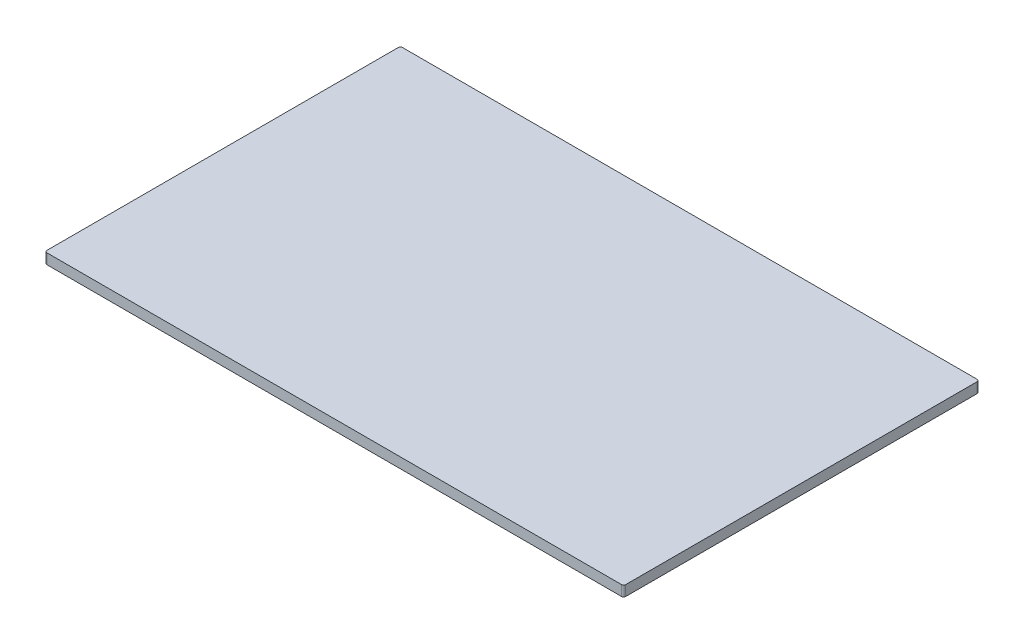
ISO-10303-21;
HEADER;
FILE_DESCRIPTION(('STEP AP214'),'2;1');
FILE_NAME('part.step','',(''),(''),'','','');
FILE_SCHEMA(('AUTOMOTIVE_DESIGN { 1 0 10303 214 1 1 1 1 }'));
ENDSEC;
DATA;
#1=APPLICATION_CONTEXT('core data for automotive mechanical design processes');
#2=APPLICATION_PROTOCOL_DEFINITION('international standard','automotive_design',2000,#1);
#3=PRODUCT_CONTEXT('',#1,'mechanical');
#4=PRODUCT('Part','Part','',(#3));
#5=PRODUCT_RELATED_PRODUCT_CATEGORY('part','',(#4));
#6=PRODUCT_DEFINITION_FORMATION('','',#4);
#7=PRODUCT_DEFINITION_CONTEXT('part definition',#1,'design');
#8=PRODUCT_DEFINITION('design','',#6,#7);
#9=PRODUCT_DEFINITION_SHAPE('','',#8);
#10=(LENGTH_UNIT() NAMED_UNIT(*) SI_UNIT(.MILLI.,.METRE.));
#11=(NAMED_UNIT(*) PLANE_ANGLE_UNIT() SI_UNIT($,.RADIAN.));
#12=(NAMED_UNIT(*) SI_UNIT($,.STERADIAN.) SOLID_ANGLE_UNIT());
#13=UNCERTAINTY_MEASURE_WITH_UNIT(LENGTH_MEASURE(1.E-05),#10,'distance_accuracy_value','');
#14=(GEOMETRIC_REPRESENTATION_CONTEXT(3) GLOBAL_UNCERTAINTY_ASSIGNED_CONTEXT((#13)) GLOBAL_UNIT_ASSIGNED_CONTEXT((#10,
#11,#12)) REPRESENTATION_CONTEXT('',''));
#15=CARTESIAN_POINT('',(0.,0.,0.));
#16=DIRECTION('',(0.,0.,1.));
#17=DIRECTION('',(1.,0.,0.));
#18=AXIS2_PLACEMENT_3D('',#15,#16,#17);
#19=CARTESIAN_POINT('',(-280.,10.,172.));
#20=DIRECTION('',(1.,0.,0.));
#21=DIRECTION('',(0.,0.,-1.));
#22=AXIS2_PLACEMENT_3D('',#19,#20,#21);
#23=PLANE('',#22);
#24=DIRECTION('',(0.,0.,1.));
#25=VECTOR('',#24,1.);
#26=CARTESIAN_POINT('',(-280.,0.,172.));
#27=LINE('',#26,#25);
#28=CARTESIAN_POINT('',(-280.,0.,-170.));
#29=VERTEX_POINT('',#28);
#30=CARTESIAN_POINT('',(-280.,0.,170.));
#31=VERTEX_POINT('',#30);
#32=EDGE_CURVE('E157',#29,#31,#27,.T.);
#33=ORIENTED_EDGE('',*,*,#32,.T.);
#34=DIRECTION('',(0.,-1.,0.));
#35=VECTOR('',#34,1.);
#36=CARTESIAN_POINT('',(-280.,10.,170.));
#37=LINE('',#36,#35);
#38=CARTESIAN_POINT('',(-280.,10.,170.));
#39=VERTEX_POINT('',#38);
#40=EDGE_CURVE('E11',#31,#39,#37,.F.);
#41=ORIENTED_EDGE('',*,*,#40,.T.);
#42=DIRECTION('',(0.,0.,1.));
#43=VECTOR('',#42,1.);
#44=CARTESIAN_POINT('',(-280.,10.,172.));
#45=LINE('',#44,#43);
#46=CARTESIAN_POINT('',(-280.,10.,-170.));
#47=VERTEX_POINT('',#46);
#48=EDGE_CURVE('E125',#47,#39,#45,.T.);
#49=ORIENTED_EDGE('',*,*,#48,.F.);
#50=DIRECTION('',(0.,-1.,0.));
#51=VECTOR('',#50,1.);
#52=CARTESIAN_POINT('',(-280.,10.,-170.));
#53=LINE('',#52,#51);
#54=EDGE_CURVE('E41',#47,#29,#53,.T.);
#55=ORIENTED_EDGE('',*,*,#54,.T.);
#56=EDGE_LOOP('',(#33,#41,#49,#55));
#57=FACE_BOUND('',#56,.T.);
#58=ADVANCED_FACE('F33',(#57),#23,.F.);
#59=CARTESIAN_POINT('',(280.,10.,172.));
#60=DIRECTION('',(0.,0.,-1.));
#61=DIRECTION('',(-1.,0.,0.));
#62=AXIS2_PLACEMENT_3D('',#59,#60,#61);
#63=PLANE('',#62);
#64=DIRECTION('',(1.,0.,0.));
#65=VECTOR('',#64,1.);
#66=CARTESIAN_POINT('',(280.,0.,172.));
#67=LINE('',#66,#65);
#68=CARTESIAN_POINT('',(-278.,0.,172.));
#69=VERTEX_POINT('',#68);
#70=CARTESIAN_POINT('',(278.,0.,172.));
#71=VERTEX_POINT('',#70);
#72=EDGE_CURVE('E130',#69,#71,#67,.T.);
#73=ORIENTED_EDGE('',*,*,#72,.T.);
#74=DIRECTION('',(0.,-1.,0.));
#75=VECTOR('',#74,1.);
#76=CARTESIAN_POINT('',(278.,10.,172.));
#77=LINE('',#76,#75);
#78=CARTESIAN_POINT('',(278.,10.,172.));
#79=VERTEX_POINT('',#78);
#80=EDGE_CURVE('E48',#71,#79,#77,.F.);
#81=ORIENTED_EDGE('',*,*,#80,.T.);
#82=DIRECTION('',(1.,0.,0.));
#83=VECTOR('',#82,1.);
#84=CARTESIAN_POINT('',(280.,10.,172.));
#85=LINE('',#84,#83);
#86=CARTESIAN_POINT('',(-278.,10.,172.));
#87=VERTEX_POINT('',#86);
#88=EDGE_CURVE('E128',#87,#79,#85,.T.);
#89=ORIENTED_EDGE('',*,*,#88,.F.);
#90=DIRECTION('',(0.,-1.,0.));
#91=VECTOR('',#90,1.);
#92=CARTESIAN_POINT('',(-278.,10.,172.));
#93=LINE('',#92,#91);
#94=EDGE_CURVE('E149',#87,#69,#93,.T.);
#95=ORIENTED_EDGE('',*,*,#94,.T.);
#96=EDGE_LOOP('',(#73,#81,#89,#95));
#97=FACE_BOUND('',#96,.T.);
#98=ADVANCED_FACE('F177',(#97),#63,.F.);
#99=CARTESIAN_POINT('',(280.,10.,172.));
#100=DIRECTION('',(-1.,0.,0.));
#101=DIRECTION('',(0.,0.,1.));
#102=AXIS2_PLACEMENT_3D('',#99,#100,#101);
#103=PLANE('',#102);
#104=DIRECTION('',(0.,0.,-1.));
#105=VECTOR('',#104,1.);
#106=CARTESIAN_POINT('',(280.,0.,172.));
#107=LINE('',#106,#105);
#108=CARTESIAN_POINT('',(280.,0.,170.));
#109=VERTEX_POINT('',#108);
#110=CARTESIAN_POINT('',(280.,0.,-170.));
#111=VERTEX_POINT('',#110);
#112=EDGE_CURVE('E126',#109,#111,#107,.T.);
#113=ORIENTED_EDGE('',*,*,#112,.T.);
#114=DIRECTION('',(0.,-1.,0.));
#115=VECTOR('',#114,1.);
#116=CARTESIAN_POINT('',(280.,10.,-170.));
#117=LINE('',#116,#115);
#118=CARTESIAN_POINT('',(280.,10.,-170.));
#119=VERTEX_POINT('',#118);
#120=EDGE_CURVE('E104',#111,#119,#117,.F.);
#121=ORIENTED_EDGE('',*,*,#120,.T.);
#122=DIRECTION('',(0.,0.,-1.));
#123=VECTOR('',#122,1.);
#124=CARTESIAN_POINT('',(280.,10.,172.));
#125=LINE('',#124,#123);
#126=CARTESIAN_POINT('',(280.,10.,170.));
#127=VERTEX_POINT('',#126);
#128=EDGE_CURVE('E165',#127,#119,#125,.T.);
#129=ORIENTED_EDGE('',*,*,#128,.F.);
#130=DIRECTION('',(0.,-1.,0.));
#131=VECTOR('',#130,1.);
#132=CARTESIAN_POINT('',(280.,10.,170.));
#133=LINE('',#132,#131);
#134=EDGE_CURVE('E109',#127,#109,#133,.T.);
#135=ORIENTED_EDGE('',*,*,#134,.T.);
#136=EDGE_LOOP('',(#113,#121,#129,#135));
#137=FACE_BOUND('',#136,.T.);
#138=ADVANCED_FACE('F176',(#137),#103,.F.);
#139=CARTESIAN_POINT('',(280.,10.,-172.));
#140=DIRECTION('',(0.,0.,1.));
#141=DIRECTION('',(1.,0.,0.));
#142=AXIS2_PLACEMENT_3D('',#139,#140,#141);
#143=PLANE('',#142);
#144=DIRECTION('',(-1.,0.,0.));
#145=VECTOR('',#144,1.);
#146=CARTESIAN_POINT('',(280.,10.,-172.));
#147=LINE('',#146,#145);
#148=CARTESIAN_POINT('',(278.,10.,-172.));
#149=VERTEX_POINT('',#148);
#150=CARTESIAN_POINT('',(-278.,10.,-172.));
#151=VERTEX_POINT('',#150);
#152=EDGE_CURVE('E119',#149,#151,#147,.T.);
#153=ORIENTED_EDGE('',*,*,#152,.F.);
#154=DIRECTION('',(0.,-1.,0.));
#155=VECTOR('',#154,1.);
#156=CARTESIAN_POINT('',(278.,10.,-172.));
#157=LINE('',#156,#155);
#158=CARTESIAN_POINT('',(278.,0.,-172.));
#159=VERTEX_POINT('',#158);
#160=EDGE_CURVE('E103',#149,#159,#157,.T.);
#161=ORIENTED_EDGE('',*,*,#160,.T.);
#162=DIRECTION('',(-1.,0.,0.));
#163=VECTOR('',#162,1.);
#164=CARTESIAN_POINT('',(280.,0.,-172.));
#165=LINE('',#164,#163);
#166=CARTESIAN_POINT('',(-278.,0.,-172.));
#167=VERTEX_POINT('',#166);
#168=EDGE_CURVE('E116',#159,#167,#165,.T.);
#169=ORIENTED_EDGE('',*,*,#168,.T.);
#170=DIRECTION('',(0.,-1.,0.));
#171=VECTOR('',#170,1.);
#172=CARTESIAN_POINT('',(-278.,10.,-172.));
#173=LINE('',#172,#171);
#174=EDGE_CURVE('E121',#167,#151,#173,.F.);
#175=ORIENTED_EDGE('',*,*,#174,.T.);
#176=EDGE_LOOP('',(#153,#161,#169,#175));
#177=FACE_BOUND('',#176,.T.);
#178=ADVANCED_FACE('F115',(#177),#143,.F.);
#179=CARTESIAN_POINT('',(0.,10.,0.));
#180=DIRECTION('',(0.,1.,0.));
#181=DIRECTION('',(0.,0.,1.));
#182=AXIS2_PLACEMENT_3D('',#179,#180,#181);
#183=PLANE('',#182);
#184=ORIENTED_EDGE('',*,*,#128,.T.);
#185=CARTESIAN_POINT('',(278.,10.,-170.));
#186=DIRECTION('',(0.,1.,0.));
#187=DIRECTION('',(0.,0.,1.));
#188=AXIS2_PLACEMENT_3D('',#185,#186,#187);
#189=CIRCLE('',#188,2.);
#190=EDGE_CURVE('E147',#119,#149,#189,.T.);
#191=ORIENTED_EDGE('',*,*,#190,.T.);
#192=ORIENTED_EDGE('',*,*,#152,.T.);
#193=CARTESIAN_POINT('',(-278.,10.,-170.));
#194=DIRECTION('',(0.,1.,0.));
#195=DIRECTION('',(0.,0.,1.));
#196=AXIS2_PLACEMENT_3D('',#193,#194,#195);
#197=CIRCLE('',#196,2.);
#198=EDGE_CURVE('E142',#151,#47,#197,.T.);
#199=ORIENTED_EDGE('',*,*,#198,.T.);
#200=ORIENTED_EDGE('',*,*,#48,.T.);
#201=CARTESIAN_POINT('',(-278.,10.,170.));
#202=DIRECTION('',(0.,1.,0.));
#203=DIRECTION('',(0.,0.,1.));
#204=AXIS2_PLACEMENT_3D('',#201,#202,#203);
#205=CIRCLE('',#204,2.);
#206=EDGE_CURVE('E55',#39,#87,#205,.T.);
#207=ORIENTED_EDGE('',*,*,#206,.T.);
#208=ORIENTED_EDGE('',*,*,#88,.T.);
#209=CARTESIAN_POINT('',(278.,10.,170.));
#210=DIRECTION('',(0.,1.,0.));
#211=DIRECTION('',(0.,0.,1.));
#212=AXIS2_PLACEMENT_3D('',#209,#210,#211);
#213=CIRCLE('',#212,2.);
#214=EDGE_CURVE('E145',#79,#127,#213,.T.);
#215=ORIENTED_EDGE('',*,*,#214,.T.);
#216=EDGE_LOOP('',(#184,#191,#192,#199,#200,#207,#208,#215));
#217=FACE_BOUND('',#216,.T.);
#218=ADVANCED_FACE('F169',(#217),#183,.T.);
#219=CARTESIAN_POINT('',(0.,0.,0.));
#220=DIRECTION('',(0.,1.,0.));
#221=DIRECTION('',(0.,0.,1.));
#222=AXIS2_PLACEMENT_3D('',#219,#220,#221);
#223=PLANE('',#222);
#224=ORIENTED_EDGE('',*,*,#168,.F.);
#225=CARTESIAN_POINT('',(278.,0.,-170.));
#226=DIRECTION('',(0.,1.,0.));
#227=DIRECTION('',(0.,0.,1.));
#228=AXIS2_PLACEMENT_3D('',#225,#226,#227);
#229=CIRCLE('',#228,2.);
#230=EDGE_CURVE('E99',#159,#111,#229,.F.);
#231=ORIENTED_EDGE('',*,*,#230,.T.);
#232=ORIENTED_EDGE('',*,*,#112,.F.);
#233=CARTESIAN_POINT('',(278.,0.,170.));
#234=DIRECTION('',(0.,1.,0.));
#235=DIRECTION('',(0.,0.,1.));
#236=AXIS2_PLACEMENT_3D('',#233,#234,#235);
#237=CIRCLE('',#236,2.);
#238=EDGE_CURVE('E110',#109,#71,#237,.F.);
#239=ORIENTED_EDGE('',*,*,#238,.T.);
#240=ORIENTED_EDGE('',*,*,#72,.F.);
#241=CARTESIAN_POINT('',(-278.,0.,170.));
#242=DIRECTION('',(0.,1.,0.));
#243=DIRECTION('',(0.,0.,1.));
#244=AXIS2_PLACEMENT_3D('',#241,#242,#243);
#245=CIRCLE('',#244,2.);
#246=EDGE_CURVE('E136',#69,#31,#245,.F.);
#247=ORIENTED_EDGE('',*,*,#246,.T.);
#248=ORIENTED_EDGE('',*,*,#32,.F.);
#249=CARTESIAN_POINT('',(-278.,0.,-170.));
#250=DIRECTION('',(0.,1.,0.));
#251=DIRECTION('',(0.,0.,1.));
#252=AXIS2_PLACEMENT_3D('',#249,#250,#251);
#253=CIRCLE('',#252,2.);
#254=EDGE_CURVE('E120',#29,#167,#253,.F.);
#255=ORIENTED_EDGE('',*,*,#254,.T.);
#256=EDGE_LOOP('',(#224,#231,#232,#239,#240,#247,#248,#255));
#257=FACE_BOUND('',#256,.T.);
#258=ADVANCED_FACE('F123',(#257),#223,.F.);
#259=CARTESIAN_POINT('',(278.,10.,-170.));
#260=DIRECTION('',(0.,-1.,0.));
#261=DIRECTION('',(0.,0.,-1.));
#262=AXIS2_PLACEMENT_3D('',#259,#260,#261);
#263=CYLINDRICAL_SURFACE('',#262,2.);
#264=ORIENTED_EDGE('',*,*,#190,.F.);
#265=ORIENTED_EDGE('',*,*,#120,.F.);
#266=ORIENTED_EDGE('',*,*,#230,.F.);
#267=ORIENTED_EDGE('',*,*,#160,.F.);
#268=EDGE_LOOP('',(#264,#265,#266,#267));
#269=FACE_BOUND('',#268,.T.);
#270=ADVANCED_FACE('F102',(#269),#263,.T.);
#271=CARTESIAN_POINT('',(278.,10.,170.));
#272=DIRECTION('',(0.,-1.,0.));
#273=DIRECTION('',(0.,0.,-1.));
#274=AXIS2_PLACEMENT_3D('',#271,#272,#273);
#275=CYLINDRICAL_SURFACE('',#274,2.);
#276=ORIENTED_EDGE('',*,*,#214,.F.);
#277=ORIENTED_EDGE('',*,*,#80,.F.);
#278=ORIENTED_EDGE('',*,*,#238,.F.);
#279=ORIENTED_EDGE('',*,*,#134,.F.);
#280=EDGE_LOOP('',(#276,#277,#278,#279));
#281=FACE_BOUND('',#280,.T.);
#282=ADVANCED_FACE('F174',(#281),#275,.T.);
#283=CARTESIAN_POINT('',(-278.,10.,170.));
#284=DIRECTION('',(0.,-1.,0.));
#285=DIRECTION('',(0.,0.,-1.));
#286=AXIS2_PLACEMENT_3D('',#283,#284,#285);
#287=CYLINDRICAL_SURFACE('',#286,2.);
#288=ORIENTED_EDGE('',*,*,#206,.F.);
#289=ORIENTED_EDGE('',*,*,#40,.F.);
#290=ORIENTED_EDGE('',*,*,#246,.F.);
#291=ORIENTED_EDGE('',*,*,#94,.F.);
#292=EDGE_LOOP('',(#288,#289,#290,#291));
#293=FACE_BOUND('',#292,.T.);
#294=ADVANCED_FACE('F179',(#293),#287,.T.);
#295=CARTESIAN_POINT('',(-278.,10.,-170.));
#296=DIRECTION('',(0.,-1.,0.));
#297=DIRECTION('',(0.,0.,-1.));
#298=AXIS2_PLACEMENT_3D('',#295,#296,#297);
#299=CYLINDRICAL_SURFACE('',#298,2.);
#300=ORIENTED_EDGE('',*,*,#198,.F.);
#301=ORIENTED_EDGE('',*,*,#174,.F.);
#302=ORIENTED_EDGE('',*,*,#254,.F.);
#303=ORIENTED_EDGE('',*,*,#54,.F.);
#304=EDGE_LOOP('',(#300,#301,#302,#303));
#305=FACE_BOUND('',#304,.T.);
#306=ADVANCED_FACE('F35',(#305),#299,.T.);
#307=CLOSED_SHELL('',(#58,#98,#138,#178,#218,#258,#270,#282,#294,#306));
#308=MANIFOLD_SOLID_BREP('B2',#307);
#309=ADVANCED_BREP_SHAPE_REPRESENTATION('',(#18,#308),#14);
#310=SHAPE_DEFINITION_REPRESENTATION(#9,#309);
ENDSEC;
END-ISO-10303-21;
